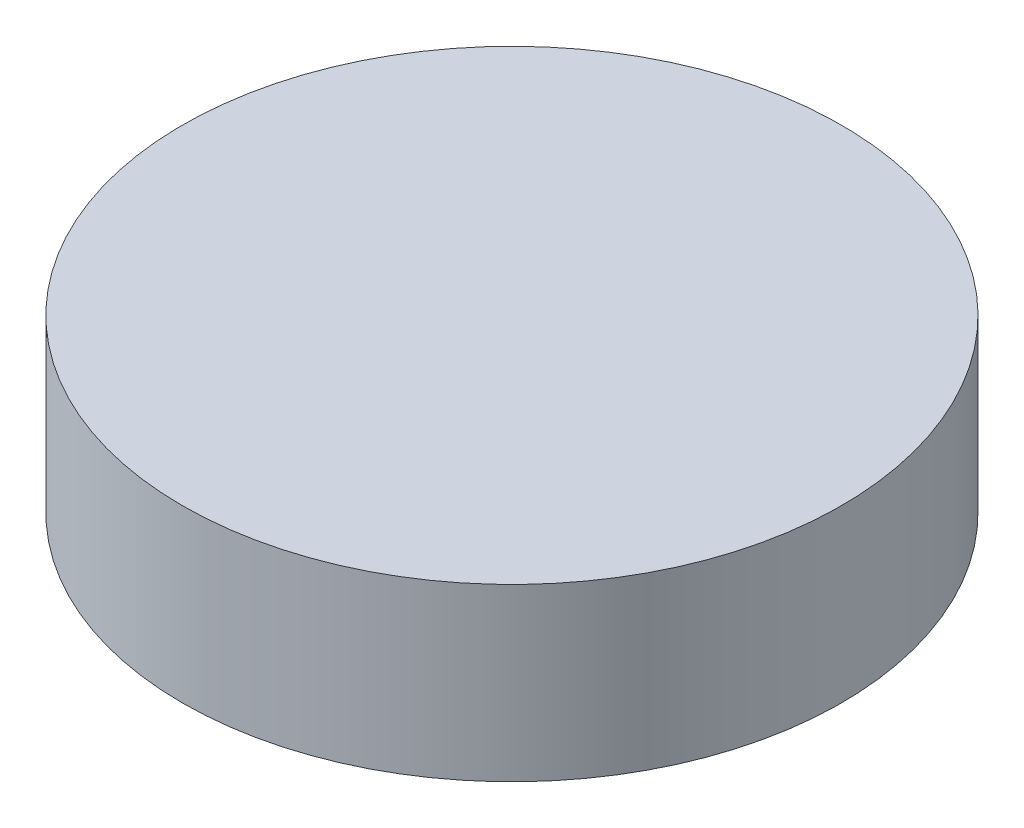
ISO-10303-21;
HEADER;
FILE_DESCRIPTION(('STEP AP214'),'2;1');
FILE_NAME('part.step','',(''),(''),'','','');
FILE_SCHEMA(('AUTOMOTIVE_DESIGN { 1 0 10303 214 1 1 1 1 }'));
ENDSEC;
DATA;
#1=APPLICATION_CONTEXT('core data for automotive mechanical design processes');
#2=APPLICATION_PROTOCOL_DEFINITION('international standard','automotive_design',2000,#1);
#3=PRODUCT_CONTEXT('',#1,'mechanical');
#4=PRODUCT('Part','Part','',(#3));
#5=PRODUCT_RELATED_PRODUCT_CATEGORY('part','',(#4));
#6=PRODUCT_DEFINITION_FORMATION('','',#4);
#7=PRODUCT_DEFINITION_CONTEXT('part definition',#1,'design');
#8=PRODUCT_DEFINITION('design','',#6,#7);
#9=PRODUCT_DEFINITION_SHAPE('','',#8);
#10=(LENGTH_UNIT() NAMED_UNIT(*) SI_UNIT(.MILLI.,.METRE.));
#11=(NAMED_UNIT(*) PLANE_ANGLE_UNIT() SI_UNIT($,.RADIAN.));
#12=(NAMED_UNIT(*) SI_UNIT($,.STERADIAN.) SOLID_ANGLE_UNIT());
#13=UNCERTAINTY_MEASURE_WITH_UNIT(LENGTH_MEASURE(1.E-05),#10,'distance_accuracy_value','');
#14=(GEOMETRIC_REPRESENTATION_CONTEXT(3) GLOBAL_UNCERTAINTY_ASSIGNED_CONTEXT((#13)) GLOBAL_UNIT_ASSIGNED_CONTEXT((#10,
#11,#12)) REPRESENTATION_CONTEXT('',''));
#15=CARTESIAN_POINT('',(0.,0.,0.));
#16=DIRECTION('',(0.,0.,1.));
#17=DIRECTION('',(1.,0.,0.));
#18=AXIS2_PLACEMENT_3D('',#15,#16,#17);
#19=CARTESIAN_POINT('',(0.,7.,0.));
#20=DIRECTION('',(0.,-1.,0.));
#21=DIRECTION('',(0.,0.,-1.));
#22=AXIS2_PLACEMENT_3D('',#19,#20,#21);
#23=CYLINDRICAL_SURFACE('',#22,13.5);
#24=CARTESIAN_POINT('',(0.,7.,0.));
#25=DIRECTION('',(0.,1.,0.));
#26=DIRECTION('',(0.,0.,1.));
#27=AXIS2_PLACEMENT_3D('',#24,#25,#26);
#28=CIRCLE('',#27,13.5);
#29=CARTESIAN_POINT('',(0.,7.,13.5));
#30=VERTEX_POINT('',#29);
#31=EDGE_CURVE('E10',#30,#30,#28,.T.);
#32=ORIENTED_EDGE('',*,*,#31,.F.);
#33=EDGE_LOOP('',(#32));
#34=FACE_BOUND('',#33,.T.);
#35=CARTESIAN_POINT('',(0.,0.,0.));
#36=DIRECTION('',(0.,1.,0.));
#37=DIRECTION('',(0.,0.,1.));
#38=AXIS2_PLACEMENT_3D('',#35,#36,#37);
#39=CIRCLE('',#38,13.5);
#40=CARTESIAN_POINT('',(0.,0.,13.5));
#41=VERTEX_POINT('',#40);
#42=EDGE_CURVE('E46',#41,#41,#39,.T.);
#43=ORIENTED_EDGE('',*,*,#42,.T.);
#44=EDGE_LOOP('',(#43));
#45=FACE_BOUND('',#44,.T.);
#46=ADVANCED_FACE('F43',(#34,#45),#23,.T.);
#47=CARTESIAN_POINT('',(0.,7.,0.));
#48=DIRECTION('',(0.,1.,0.));
#49=DIRECTION('',(0.,0.,1.));
#50=AXIS2_PLACEMENT_3D('',#47,#48,#49);
#51=PLANE('',#50);
#52=ORIENTED_EDGE('',*,*,#31,.T.);
#53=EDGE_LOOP('',(#52));
#54=FACE_BOUND('',#53,.T.);
#55=ADVANCED_FACE('F60',(#54),#51,.T.);
#56=CARTESIAN_POINT('',(0.,0.,0.));
#57=DIRECTION('',(0.,1.,0.));
#58=DIRECTION('',(0.,0.,1.));
#59=AXIS2_PLACEMENT_3D('',#56,#57,#58);
#60=PLANE('',#59);
#61=ORIENTED_EDGE('',*,*,#42,.F.);
#62=EDGE_LOOP('',(#61));
#63=FACE_BOUND('',#62,.T.);
#64=ADVANCED_FACE('F58',(#63),#60,.F.);
#65=CLOSED_SHELL('',(#46,#55,#64));
#66=MANIFOLD_SOLID_BREP('B2',#65);
#67=ADVANCED_BREP_SHAPE_REPRESENTATION('',(#18,#66),#14);
#68=SHAPE_DEFINITION_REPRESENTATION(#9,#67);
ENDSEC;
END-ISO-10303-21;
